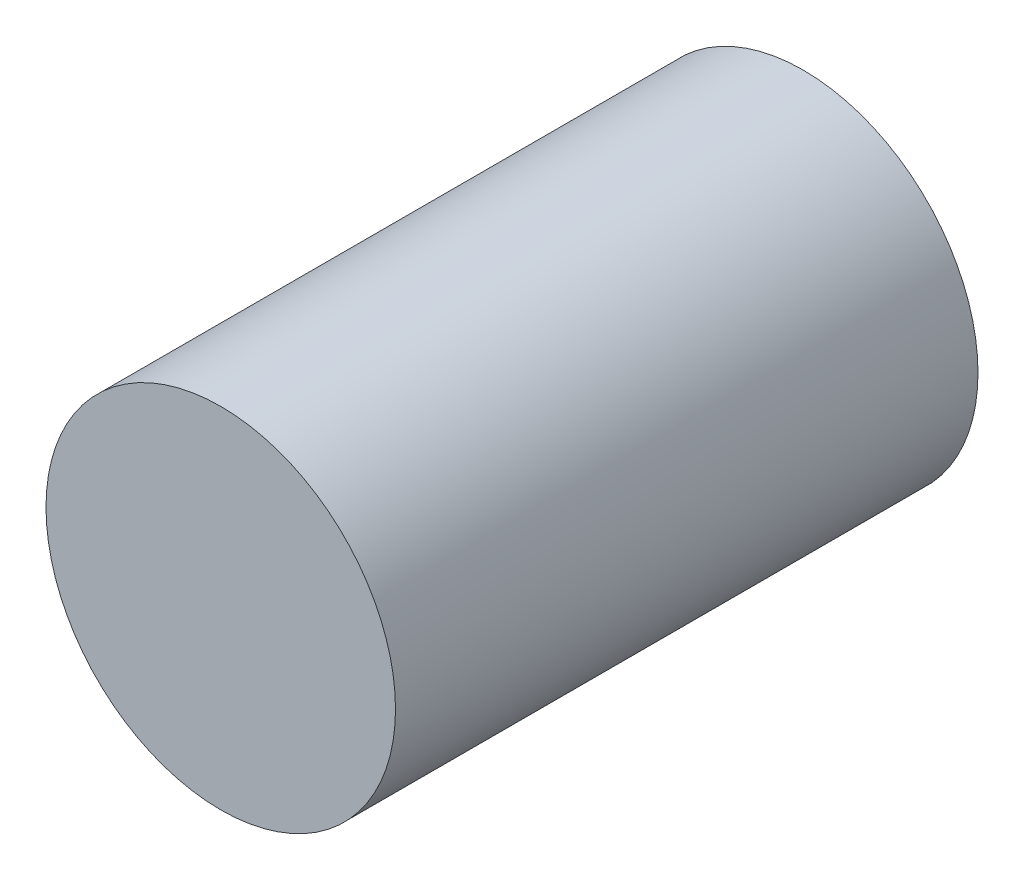
ISO-10303-21;
HEADER;
FILE_DESCRIPTION(('STEP AP214'),'2;1');
FILE_NAME('part.step','',(''),(''),'','','');
FILE_SCHEMA(('AUTOMOTIVE_DESIGN { 1 0 10303 214 1 1 1 1 }'));
ENDSEC;
DATA;
#1=APPLICATION_CONTEXT('core data for automotive mechanical design processes');
#2=APPLICATION_PROTOCOL_DEFINITION('international standard','automotive_design',2000,#1);
#3=PRODUCT_CONTEXT('',#1,'mechanical');
#4=PRODUCT('Part','Part','',(#3));
#5=PRODUCT_RELATED_PRODUCT_CATEGORY('part','',(#4));
#6=PRODUCT_DEFINITION_FORMATION('','',#4);
#7=PRODUCT_DEFINITION_CONTEXT('part definition',#1,'design');
#8=PRODUCT_DEFINITION('design','',#6,#7);
#9=PRODUCT_DEFINITION_SHAPE('','',#8);
#10=(LENGTH_UNIT() NAMED_UNIT(*) SI_UNIT(.MILLI.,.METRE.));
#11=(NAMED_UNIT(*) PLANE_ANGLE_UNIT() SI_UNIT($,.RADIAN.));
#12=(NAMED_UNIT(*) SI_UNIT($,.STERADIAN.) SOLID_ANGLE_UNIT());
#13=UNCERTAINTY_MEASURE_WITH_UNIT(LENGTH_MEASURE(1.E-05),#10,'distance_accuracy_value','');
#14=(GEOMETRIC_REPRESENTATION_CONTEXT(3) GLOBAL_UNCERTAINTY_ASSIGNED_CONTEXT((#13)) GLOBAL_UNIT_ASSIGNED_CONTEXT((#10,
#11,#12)) REPRESENTATION_CONTEXT('',''));
#15=CARTESIAN_POINT('',(0.,0.,0.));
#16=DIRECTION('',(0.,0.,1.));
#17=DIRECTION('',(1.,0.,0.));
#18=AXIS2_PLACEMENT_3D('',#15,#16,#17);
#19=CARTESIAN_POINT('',(0.,0.,5.));
#20=DIRECTION('',(0.,0.,-1.));
#21=DIRECTION('',(-1.,0.,0.));
#22=AXIS2_PLACEMENT_3D('',#19,#20,#21);
#23=CYLINDRICAL_SURFACE('',#22,1.5);
#24=CARTESIAN_POINT('',(0.,0.,5.));
#25=DIRECTION('',(0.,0.,1.));
#26=DIRECTION('',(1.,0.,0.));
#27=AXIS2_PLACEMENT_3D('',#24,#25,#26);
#28=CIRCLE('',#27,1.5);
#29=CARTESIAN_POINT('',(1.5,0.,5.));
#30=VERTEX_POINT('',#29);
#31=EDGE_CURVE('E10',#30,#30,#28,.T.);
#32=ORIENTED_EDGE('',*,*,#31,.F.);
#33=EDGE_LOOP('',(#32));
#34=FACE_BOUND('',#33,.T.);
#35=CARTESIAN_POINT('',(0.,0.,0.));
#36=DIRECTION('',(0.,0.,1.));
#37=DIRECTION('',(1.,0.,0.));
#38=AXIS2_PLACEMENT_3D('',#35,#36,#37);
#39=CIRCLE('',#38,1.5);
#40=CARTESIAN_POINT('',(1.5,0.,0.));
#41=VERTEX_POINT('',#40);
#42=EDGE_CURVE('E36',#41,#41,#39,.T.);
#43=ORIENTED_EDGE('',*,*,#42,.T.);
#44=EDGE_LOOP('',(#43));
#45=FACE_BOUND('',#44,.T.);
#46=ADVANCED_FACE('F33',(#34,#45),#23,.T.);
#47=CARTESIAN_POINT('',(0.,0.,5.));
#48=DIRECTION('',(0.,0.,1.));
#49=DIRECTION('',(1.,0.,0.));
#50=AXIS2_PLACEMENT_3D('',#47,#48,#49);
#51=PLANE('',#50);
#52=ORIENTED_EDGE('',*,*,#31,.T.);
#53=EDGE_LOOP('',(#52));
#54=FACE_BOUND('',#53,.T.);
#55=ADVANCED_FACE('F48',(#54),#51,.T.);
#56=CARTESIAN_POINT('',(0.,0.,0.));
#57=DIRECTION('',(0.,0.,1.));
#58=DIRECTION('',(1.,0.,0.));
#59=AXIS2_PLACEMENT_3D('',#56,#57,#58);
#60=PLANE('',#59);
#61=ORIENTED_EDGE('',*,*,#42,.F.);
#62=EDGE_LOOP('',(#61));
#63=FACE_BOUND('',#62,.T.);
#64=ADVANCED_FACE('F46',(#63),#60,.F.);
#65=CLOSED_SHELL('',(#46,#55,#64));
#66=MANIFOLD_SOLID_BREP('B2',#65);
#67=ADVANCED_BREP_SHAPE_REPRESENTATION('',(#18,#66),#14);
#68=SHAPE_DEFINITION_REPRESENTATION(#9,#67);
ENDSEC;
END-ISO-10303-21;
